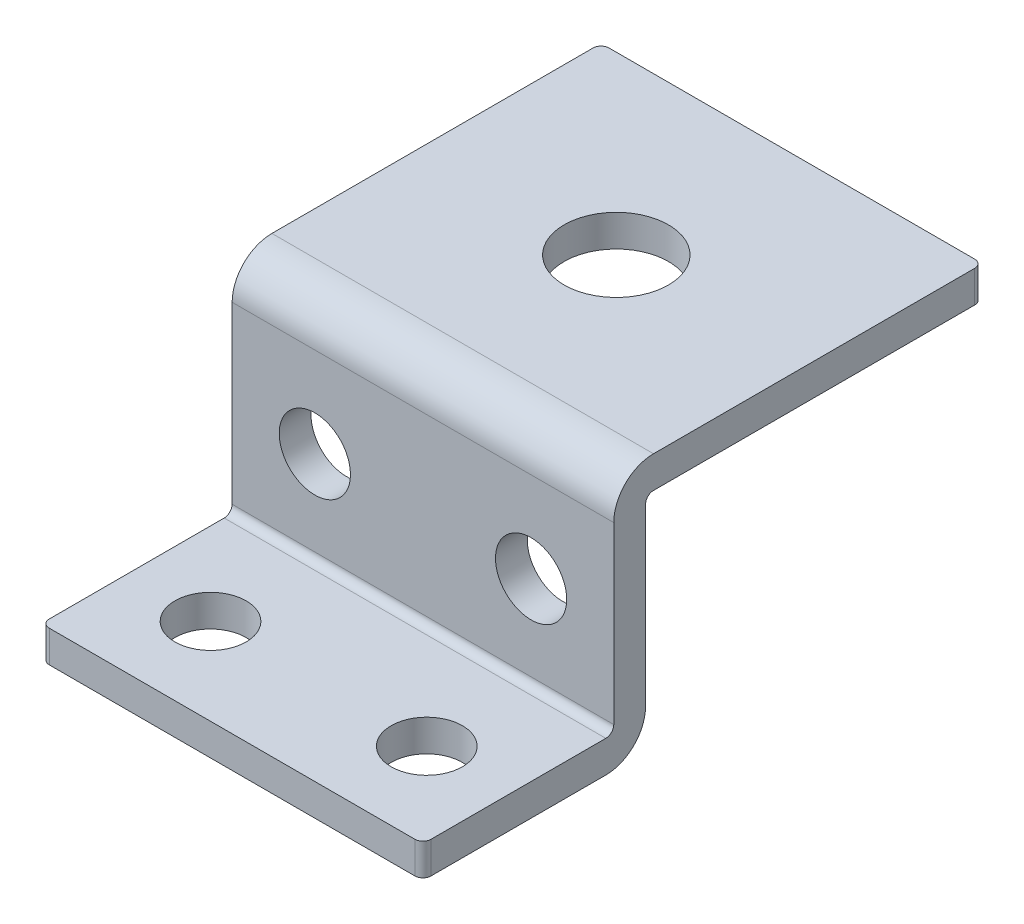
ISO-10303-21;
HEADER;
FILE_DESCRIPTION(('STEP AP214'),'2;1');
FILE_NAME('part.step','',(''),(''),'','','');
FILE_SCHEMA(('AUTOMOTIVE_DESIGN { 1 0 10303 214 1 1 1 1 }'));
ENDSEC;
DATA;
#1=APPLICATION_CONTEXT('core data for automotive mechanical design processes');
#2=APPLICATION_PROTOCOL_DEFINITION('international standard','automotive_design',2000,#1);
#3=PRODUCT_CONTEXT('',#1,'mechanical');
#4=PRODUCT('Part','Part','',(#3));
#5=PRODUCT_RELATED_PRODUCT_CATEGORY('part','',(#4));
#6=PRODUCT_DEFINITION_FORMATION('','',#4);
#7=PRODUCT_DEFINITION_CONTEXT('part definition',#1,'design');
#8=PRODUCT_DEFINITION('design','',#6,#7);
#9=PRODUCT_DEFINITION_SHAPE('','',#8);
#10=(LENGTH_UNIT() NAMED_UNIT(*) SI_UNIT(.MILLI.,.METRE.));
#11=(NAMED_UNIT(*) PLANE_ANGLE_UNIT() SI_UNIT($,.RADIAN.));
#12=(NAMED_UNIT(*) SI_UNIT($,.STERADIAN.) SOLID_ANGLE_UNIT());
#13=UNCERTAINTY_MEASURE_WITH_UNIT(LENGTH_MEASURE(1.E-05),#10,'distance_accuracy_value','');
#14=(GEOMETRIC_REPRESENTATION_CONTEXT(3) GLOBAL_UNCERTAINTY_ASSIGNED_CONTEXT((#13)) GLOBAL_UNIT_ASSIGNED_CONTEXT((#10,
#11,#12)) REPRESENTATION_CONTEXT('',''));
#15=CARTESIAN_POINT('',(0.,0.,0.));
#16=DIRECTION('',(0.,0.,1.));
#17=DIRECTION('',(1.,0.,0.));
#18=AXIS2_PLACEMENT_3D('',#15,#16,#17);
#19=CARTESIAN_POINT('',(19.05,9.525,4.92125));
#20=DIRECTION('',(0.,1.,0.));
#21=DIRECTION('',(0.,0.,1.));
#22=AXIS2_PLACEMENT_3D('',#19,#20,#21);
#23=PLANE('',#22);
#24=CARTESIAN_POINT('',(0.,9.525,-10.414));
#25=DIRECTION('',(0.,1.,0.));
#26=DIRECTION('',(0.,0.,1.));
#27=AXIS2_PLACEMENT_3D('',#24,#25,#26);
#28=CIRCLE('',#27,5.20699999999996);
#29=CARTESIAN_POINT('',(0.,9.525,-5.20700000000004));
#30=VERTEX_POINT('',#29);
#31=EDGE_CURVE('E191',#30,#30,#28,.T.);
#32=ORIENTED_EDGE('',*,*,#31,.T.);
#33=EDGE_LOOP('',(#32));
#34=FACE_BOUND('',#33,.T.);
#35=DIRECTION('',(0.,0.,-1.));
#36=VECTOR('',#35,1.);
#37=CARTESIAN_POINT('',(-19.05,9.525,4.92125));
#38=LINE('',#37,#36);
#39=CARTESIAN_POINT('',(-19.05,9.525,4.92125));
#40=VERTEX_POINT('',#39);
#41=CARTESIAN_POINT('',(-19.05,9.525,-27.14625));
#42=VERTEX_POINT('',#41);
#43=EDGE_CURVE('E188',#40,#42,#38,.T.);
#44=ORIENTED_EDGE('',*,*,#43,.T.);
#45=CARTESIAN_POINT('',(-18.25625,9.525,-27.14625));
#46=DIRECTION('',(0.,1.,0.));
#47=DIRECTION('',(0.,0.,1.));
#48=AXIS2_PLACEMENT_3D('',#45,#46,#47);
#49=CIRCLE('',#48,0.79375);
#50=CARTESIAN_POINT('',(-18.25625,9.525,-27.94));
#51=VERTEX_POINT('',#50);
#52=EDGE_CURVE('E269',#42,#51,#49,.F.);
#53=ORIENTED_EDGE('',*,*,#52,.T.);
#54=DIRECTION('',(-1.,0.,0.));
#55=VECTOR('',#54,1.);
#56=CARTESIAN_POINT('',(19.05,9.525,-27.94));
#57=LINE('',#56,#55);
#58=CARTESIAN_POINT('',(18.25625,9.525,-27.94));
#59=VERTEX_POINT('',#58);
#60=EDGE_CURVE('E235',#59,#51,#57,.T.);
#61=ORIENTED_EDGE('',*,*,#60,.F.);
#62=CARTESIAN_POINT('',(18.25625,9.525,-27.14625));
#63=DIRECTION('',(0.,1.,0.));
#64=DIRECTION('',(0.,0.,1.));
#65=AXIS2_PLACEMENT_3D('',#62,#63,#64);
#66=CIRCLE('',#65,0.79375);
#67=CARTESIAN_POINT('',(19.05,9.525,-27.14625));
#68=VERTEX_POINT('',#67);
#69=EDGE_CURVE('E267',#59,#68,#66,.F.);
#70=ORIENTED_EDGE('',*,*,#69,.T.);
#71=DIRECTION('',(0.,0.,-1.));
#72=VECTOR('',#71,1.);
#73=CARTESIAN_POINT('',(19.05,9.525,4.92125));
#74=LINE('',#73,#72);
#75=CARTESIAN_POINT('',(19.05,9.525,4.92125));
#76=VERTEX_POINT('',#75);
#77=EDGE_CURVE('E166',#76,#68,#74,.T.);
#78=ORIENTED_EDGE('',*,*,#77,.F.);
#79=DIRECTION('',(-1.,0.,0.));
#80=VECTOR('',#79,1.);
#81=CARTESIAN_POINT('',(19.05,9.525,4.92125));
#82=LINE('',#81,#80);
#83=EDGE_CURVE('E187',#76,#40,#82,.T.);
#84=ORIENTED_EDGE('',*,*,#83,.T.);
#85=EDGE_LOOP('',(#44,#53,#61,#70,#78,#84));
#86=FACE_BOUND('',#85,.T.);
#87=ADVANCED_FACE('F32',(#34,#86),#23,.F.);
#88=CARTESIAN_POINT('',(19.05,12.7,-27.94));
#89=DIRECTION('',(0.,0.,-1.));
#90=DIRECTION('',(-1.,0.,0.));
#91=AXIS2_PLACEMENT_3D('',#88,#89,#90);
#92=PLANE('',#91);
#93=ORIENTED_EDGE('',*,*,#60,.T.);
#94=DIRECTION('',(0.,-1.,0.));
#95=VECTOR('',#94,1.);
#96=CARTESIAN_POINT('',(-18.25625,12.7,-27.94));
#97=LINE('',#96,#95);
#98=CARTESIAN_POINT('',(-18.25625,12.7,-27.94));
#99=VERTEX_POINT('',#98);
#100=EDGE_CURVE('E47',#51,#99,#97,.F.);
#101=ORIENTED_EDGE('',*,*,#100,.T.);
#102=DIRECTION('',(-1.,0.,0.));
#103=VECTOR('',#102,1.);
#104=CARTESIAN_POINT('',(19.05,12.7,-27.94));
#105=LINE('',#104,#103);
#106=CARTESIAN_POINT('',(18.25625,12.7,-27.94));
#107=VERTEX_POINT('',#106);
#108=EDGE_CURVE('E153',#107,#99,#105,.T.);
#109=ORIENTED_EDGE('',*,*,#108,.F.);
#110=DIRECTION('',(0.,-1.,0.));
#111=VECTOR('',#110,1.);
#112=CARTESIAN_POINT('',(18.25625,9.525,-27.94));
#113=LINE('',#112,#111);
#114=EDGE_CURVE('E271',#107,#59,#113,.T.);
#115=ORIENTED_EDGE('',*,*,#114,.T.);
#116=EDGE_LOOP('',(#93,#101,#109,#115));
#117=FACE_BOUND('',#116,.T.);
#118=ADVANCED_FACE('F276',(#117),#92,.T.);
#119=CARTESIAN_POINT('',(19.05,12.7,4.92125));
#120=DIRECTION('',(0.,1.,0.));
#121=DIRECTION('',(0.,0.,1.));
#122=AXIS2_PLACEMENT_3D('',#119,#120,#121);
#123=PLANE('',#122);
#124=CARTESIAN_POINT('',(0.,12.7,-10.414));
#125=DIRECTION('',(0.,1.,0.));
#126=DIRECTION('',(0.,0.,1.));
#127=AXIS2_PLACEMENT_3D('',#124,#125,#126);
#128=CIRCLE('',#127,5.20699999999996);
#129=CARTESIAN_POINT('',(0.,12.7,-5.20700000000004));
#130=VERTEX_POINT('',#129);
#131=EDGE_CURVE('E341',#130,#130,#128,.T.);
#132=ORIENTED_EDGE('',*,*,#131,.F.);
#133=EDGE_LOOP('',(#132));
#134=FACE_BOUND('',#133,.T.);
#135=ORIENTED_EDGE('',*,*,#108,.T.);
#136=CARTESIAN_POINT('',(-18.25625,12.7,-27.14625));
#137=DIRECTION('',(0.,1.,0.));
#138=DIRECTION('',(0.,0.,1.));
#139=AXIS2_PLACEMENT_3D('',#136,#137,#138);
#140=CIRCLE('',#139,0.79375);
#141=CARTESIAN_POINT('',(-19.05,12.7,-27.14625));
#142=VERTEX_POINT('',#141);
#143=EDGE_CURVE('E11',#99,#142,#140,.T.);
#144=ORIENTED_EDGE('',*,*,#143,.T.);
#145=DIRECTION('',(0.,0.,-1.));
#146=VECTOR('',#145,1.);
#147=CARTESIAN_POINT('',(-19.05,12.7,4.92125));
#148=LINE('',#147,#146);
#149=CARTESIAN_POINT('',(-19.05,12.7,4.92125));
#150=VERTEX_POINT('',#149);
#151=EDGE_CURVE('E148',#150,#142,#148,.T.);
#152=ORIENTED_EDGE('',*,*,#151,.F.);
#153=DIRECTION('',(-1.,0.,0.));
#154=VECTOR('',#153,1.);
#155=CARTESIAN_POINT('',(19.05,12.7,4.92125));
#156=LINE('',#155,#154);
#157=CARTESIAN_POINT('',(19.05,12.7,4.92125));
#158=VERTEX_POINT('',#157);
#159=EDGE_CURVE('E143',#158,#150,#156,.T.);
#160=ORIENTED_EDGE('',*,*,#159,.F.);
#161=DIRECTION('',(0.,0.,-1.));
#162=VECTOR('',#161,1.);
#163=CARTESIAN_POINT('',(19.05,12.7,4.92125));
#164=LINE('',#163,#162);
#165=CARTESIAN_POINT('',(19.05,12.7,-27.14625));
#166=VERTEX_POINT('',#165);
#167=EDGE_CURVE('E146',#158,#166,#164,.T.);
#168=ORIENTED_EDGE('',*,*,#167,.T.);
#169=CARTESIAN_POINT('',(18.25625,12.7,-27.14625));
#170=DIRECTION('',(0.,1.,0.));
#171=DIRECTION('',(0.,0.,1.));
#172=AXIS2_PLACEMENT_3D('',#169,#170,#171);
#173=CIRCLE('',#172,0.79375);
#174=EDGE_CURVE('E40',#166,#107,#173,.T.);
#175=ORIENTED_EDGE('',*,*,#174,.T.);
#176=EDGE_LOOP('',(#135,#144,#152,#160,#168,#175));
#177=FACE_BOUND('',#176,.T.);
#178=ADVANCED_FACE('F145',(#134,#177),#123,.T.);
#179=CARTESIAN_POINT('',(19.05,8.73125,4.92125));
#180=DIRECTION('',(-1.,0.,0.));
#181=DIRECTION('',(0.,0.,1.));
#182=AXIS2_PLACEMENT_3D('',#179,#180,#181);
#183=CYLINDRICAL_SURFACE('',#182,3.96875);
#184=CARTESIAN_POINT('',(-19.05,8.73125,4.92125));
#185=DIRECTION('',(-1.,0.,0.));
#186=DIRECTION('',(0.,0.,-1.));
#187=AXIS2_PLACEMENT_3D('',#184,#185,#186);
#188=CIRCLE('',#187,3.96875);
#189=CARTESIAN_POINT('',(-19.05,8.73125,8.89));
#190=VERTEX_POINT('',#189);
#191=EDGE_CURVE('E193',#190,#150,#188,.T.);
#192=ORIENTED_EDGE('',*,*,#191,.F.);
#193=DIRECTION('',(-1.,0.,0.));
#194=VECTOR('',#193,1.);
#195=CARTESIAN_POINT('',(19.05,8.73125,8.89));
#196=LINE('',#195,#194);
#197=CARTESIAN_POINT('',(19.05,8.73125,8.89));
#198=VERTEX_POINT('',#197);
#199=EDGE_CURVE('E154',#198,#190,#196,.T.);
#200=ORIENTED_EDGE('',*,*,#199,.F.);
#201=CARTESIAN_POINT('',(19.05,8.73125,4.92125));
#202=DIRECTION('',(-1.,0.,0.));
#203=DIRECTION('',(0.,0.,-1.));
#204=AXIS2_PLACEMENT_3D('',#201,#202,#203);
#205=CIRCLE('',#204,3.96875);
#206=EDGE_CURVE('E161',#198,#158,#205,.T.);
#207=ORIENTED_EDGE('',*,*,#206,.T.);
#208=ORIENTED_EDGE('',*,*,#159,.T.);
#209=EDGE_LOOP('',(#192,#200,#207,#208));
#210=FACE_BOUND('',#209,.T.);
#211=ADVANCED_FACE('F168',(#210),#183,.T.);
#212=CARTESIAN_POINT('',(19.05,-8.73125,8.89));
#213=DIRECTION('',(0.,0.,1.));
#214=DIRECTION('',(0.,-1.,0.));
#215=AXIS2_PLACEMENT_3D('',#212,#213,#214);
#216=PLANE('',#215);
#217=CARTESIAN_POINT('',(10.795,-0.254000000000001,8.89));
#218=DIRECTION('',(0.,0.,1.));
#219=DIRECTION('',(0.,-1.,0.));
#220=AXIS2_PLACEMENT_3D('',#217,#218,#219);
#221=CIRCLE('',#220,3.556);
#222=CARTESIAN_POINT('',(14.351,-0.254000000000001,8.89));
#223=VERTEX_POINT('',#222);
#224=EDGE_CURVE('E245',#223,#223,#221,.T.);
#225=ORIENTED_EDGE('',*,*,#224,.F.);
#226=EDGE_LOOP('',(#225));
#227=FACE_BOUND('',#226,.T.);
#228=CARTESIAN_POINT('',(-10.795,-0.254000000000001,8.89));
#229=DIRECTION('',(0.,0.,1.));
#230=DIRECTION('',(0.,-1.,0.));
#231=AXIS2_PLACEMENT_3D('',#228,#229,#230);
#232=CIRCLE('',#231,3.556);
#233=CARTESIAN_POINT('',(-7.239,-0.254000000000001,8.89));
#234=VERTEX_POINT('',#233);
#235=EDGE_CURVE('E241',#234,#234,#232,.T.);
#236=ORIENTED_EDGE('',*,*,#235,.F.);
#237=EDGE_LOOP('',(#236));
#238=FACE_BOUND('',#237,.T.);
#239=DIRECTION('',(0.,1.,0.));
#240=VECTOR('',#239,1.);
#241=CARTESIAN_POINT('',(-19.05,-8.73125,8.89));
#242=LINE('',#241,#240);
#243=CARTESIAN_POINT('',(-19.05,-8.73125,8.89));
#244=VERTEX_POINT('',#243);
#245=EDGE_CURVE('E195',#244,#190,#242,.T.);
#246=ORIENTED_EDGE('',*,*,#245,.F.);
#247=DIRECTION('',(-1.,0.,0.));
#248=VECTOR('',#247,1.);
#249=CARTESIAN_POINT('',(19.05,-8.73125,8.89));
#250=LINE('',#249,#248);
#251=CARTESIAN_POINT('',(19.05,-8.73125,8.89));
#252=VERTEX_POINT('',#251);
#253=EDGE_CURVE('E231',#252,#244,#250,.T.);
#254=ORIENTED_EDGE('',*,*,#253,.F.);
#255=DIRECTION('',(0.,1.,0.));
#256=VECTOR('',#255,1.);
#257=CARTESIAN_POINT('',(19.05,-8.73125,8.89));
#258=LINE('',#257,#256);
#259=EDGE_CURVE('E169',#252,#198,#258,.T.);
#260=ORIENTED_EDGE('',*,*,#259,.T.);
#261=ORIENTED_EDGE('',*,*,#199,.T.);
#262=EDGE_LOOP('',(#246,#254,#260,#261));
#263=FACE_BOUND('',#262,.T.);
#264=ADVANCED_FACE('F292',(#227,#238,#263),#216,.T.);
#265=CARTESIAN_POINT('',(19.05,-8.73125,9.68375));
#266=DIRECTION('',(-1.,0.,0.));
#267=DIRECTION('',(0.,0.,1.));
#268=AXIS2_PLACEMENT_3D('',#265,#266,#267);
#269=CYLINDRICAL_SURFACE('',#268,0.793749999999999);
#270=CARTESIAN_POINT('',(-19.05,-8.73125,9.68375));
#271=DIRECTION('',(1.,0.,0.));
#272=DIRECTION('',(0.,0.,-1.));
#273=AXIS2_PLACEMENT_3D('',#270,#271,#272);
#274=CIRCLE('',#273,0.793749999999999);
#275=CARTESIAN_POINT('',(-19.05,-9.525,9.68375));
#276=VERTEX_POINT('',#275);
#277=EDGE_CURVE('E198',#276,#244,#274,.T.);
#278=ORIENTED_EDGE('',*,*,#277,.F.);
#279=DIRECTION('',(-1.,0.,0.));
#280=VECTOR('',#279,1.);
#281=CARTESIAN_POINT('',(19.05,-9.525,9.68375));
#282=LINE('',#281,#280);
#283=CARTESIAN_POINT('',(19.05,-9.525,9.68375));
#284=VERTEX_POINT('',#283);
#285=EDGE_CURVE('E228',#284,#276,#282,.T.);
#286=ORIENTED_EDGE('',*,*,#285,.F.);
#287=CARTESIAN_POINT('',(19.05,-8.73125,9.68375));
#288=DIRECTION('',(1.,0.,0.));
#289=DIRECTION('',(0.,0.,-1.));
#290=AXIS2_PLACEMENT_3D('',#287,#288,#289);
#291=CIRCLE('',#290,0.793749999999999);
#292=EDGE_CURVE('E171',#284,#252,#291,.T.);
#293=ORIENTED_EDGE('',*,*,#292,.T.);
#294=ORIENTED_EDGE('',*,*,#253,.T.);
#295=EDGE_LOOP('',(#278,#286,#293,#294));
#296=FACE_BOUND('',#295,.T.);
#297=ADVANCED_FACE('F296',(#296),#269,.F.);
#298=CARTESIAN_POINT('',(19.05,-9.525,27.94));
#299=DIRECTION('',(0.,1.,0.));
#300=DIRECTION('',(0.,0.,1.));
#301=AXIS2_PLACEMENT_3D('',#298,#299,#300);
#302=PLANE('',#301);
#303=CARTESIAN_POINT('',(10.795,-9.525,19.304));
#304=DIRECTION('',(0.,1.,0.));
#305=DIRECTION('',(0.,0.,1.));
#306=AXIS2_PLACEMENT_3D('',#303,#304,#305);
#307=CIRCLE('',#306,3.556);
#308=CARTESIAN_POINT('',(10.795,-9.525,22.86));
#309=VERTEX_POINT('',#308);
#310=EDGE_CURVE('E335',#309,#309,#307,.T.);
#311=ORIENTED_EDGE('',*,*,#310,.F.);
#312=EDGE_LOOP('',(#311));
#313=FACE_BOUND('',#312,.T.);
#314=CARTESIAN_POINT('',(-10.795,-9.525,19.304));
#315=DIRECTION('',(0.,1.,0.));
#316=DIRECTION('',(0.,0.,1.));
#317=AXIS2_PLACEMENT_3D('',#314,#315,#316);
#318=CIRCLE('',#317,3.556);
#319=CARTESIAN_POINT('',(-10.795,-9.525,22.86));
#320=VERTEX_POINT('',#319);
#321=EDGE_CURVE('E338',#320,#320,#318,.T.);
#322=ORIENTED_EDGE('',*,*,#321,.F.);
#323=EDGE_LOOP('',(#322));
#324=FACE_BOUND('',#323,.T.);
#325=DIRECTION('',(0.,0.,-1.));
#326=VECTOR('',#325,1.);
#327=CARTESIAN_POINT('',(-19.05,-9.525,27.94));
#328=LINE('',#327,#326);
#329=CARTESIAN_POINT('',(-19.05,-9.525,27.14625));
#330=VERTEX_POINT('',#329);
#331=EDGE_CURVE('E201',#330,#276,#328,.T.);
#332=ORIENTED_EDGE('',*,*,#331,.F.);
#333=CARTESIAN_POINT('',(-18.25625,-9.525,27.14625));
#334=DIRECTION('',(0.,1.,0.));
#335=DIRECTION('',(0.,0.,1.));
#336=AXIS2_PLACEMENT_3D('',#333,#334,#335);
#337=CIRCLE('',#336,0.79375);
#338=CARTESIAN_POINT('',(-18.25625,-9.525,27.94));
#339=VERTEX_POINT('',#338);
#340=EDGE_CURVE('E253',#330,#339,#337,.T.);
#341=ORIENTED_EDGE('',*,*,#340,.T.);
#342=DIRECTION('',(-1.,0.,0.));
#343=VECTOR('',#342,1.);
#344=CARTESIAN_POINT('',(19.05,-9.525,27.94));
#345=LINE('',#344,#343);
#346=CARTESIAN_POINT('',(18.25625,-9.525,27.94));
#347=VERTEX_POINT('',#346);
#348=EDGE_CURVE('E225',#347,#339,#345,.T.);
#349=ORIENTED_EDGE('',*,*,#348,.F.);
#350=CARTESIAN_POINT('',(18.25625,-9.525,27.14625));
#351=DIRECTION('',(0.,1.,0.));
#352=DIRECTION('',(0.,0.,1.));
#353=AXIS2_PLACEMENT_3D('',#350,#351,#352);
#354=CIRCLE('',#353,0.79375);
#355=CARTESIAN_POINT('',(19.05,-9.525,27.14625));
#356=VERTEX_POINT('',#355);
#357=EDGE_CURVE('E251',#347,#356,#354,.T.);
#358=ORIENTED_EDGE('',*,*,#357,.T.);
#359=DIRECTION('',(0.,0.,-1.));
#360=VECTOR('',#359,1.);
#361=CARTESIAN_POINT('',(19.05,-9.525,27.94));
#362=LINE('',#361,#360);
#363=EDGE_CURVE('E177',#356,#284,#362,.T.);
#364=ORIENTED_EDGE('',*,*,#363,.T.);
#365=ORIENTED_EDGE('',*,*,#285,.T.);
#366=EDGE_LOOP('',(#332,#341,#349,#358,#364,#365));
#367=FACE_BOUND('',#366,.T.);
#368=ADVANCED_FACE('F299',(#313,#324,#367),#302,.T.);
#369=CARTESIAN_POINT('',(19.05,-12.7,27.94));
#370=DIRECTION('',(0.,0.,1.));
#371=DIRECTION('',(1.,0.,0.));
#372=AXIS2_PLACEMENT_3D('',#369,#370,#371);
#373=PLANE('',#372);
#374=ORIENTED_EDGE('',*,*,#348,.T.);
#375=DIRECTION('',(0.,1.,0.));
#376=VECTOR('',#375,1.);
#377=CARTESIAN_POINT('',(-18.25625,-12.7,27.94));
#378=LINE('',#377,#376);
#379=CARTESIAN_POINT('',(-18.25625,-12.7,27.94));
#380=VERTEX_POINT('',#379);
#381=EDGE_CURVE('E258',#339,#380,#378,.F.);
#382=ORIENTED_EDGE('',*,*,#381,.T.);
#383=DIRECTION('',(-1.,0.,0.));
#384=VECTOR('',#383,1.);
#385=CARTESIAN_POINT('',(19.05,-12.7,27.94));
#386=LINE('',#385,#384);
#387=CARTESIAN_POINT('',(18.25625,-12.7,27.94));
#388=VERTEX_POINT('',#387);
#389=EDGE_CURVE('E222',#388,#380,#386,.T.);
#390=ORIENTED_EDGE('',*,*,#389,.F.);
#391=DIRECTION('',(0.,1.,0.));
#392=VECTOR('',#391,1.);
#393=CARTESIAN_POINT('',(18.25625,-9.525,27.94));
#394=LINE('',#393,#392);
#395=EDGE_CURVE('E255',#388,#347,#394,.T.);
#396=ORIENTED_EDGE('',*,*,#395,.T.);
#397=EDGE_LOOP('',(#374,#382,#390,#396));
#398=FACE_BOUND('',#397,.T.);
#399=ADVANCED_FACE('F313',(#398),#373,.T.);
#400=CARTESIAN_POINT('',(19.05,-12.7,27.94));
#401=DIRECTION('',(0.,1.,0.));
#402=DIRECTION('',(0.,0.,1.));
#403=AXIS2_PLACEMENT_3D('',#400,#401,#402);
#404=PLANE('',#403);
#405=CARTESIAN_POINT('',(10.795,-12.7,19.304));
#406=DIRECTION('',(0.,1.,0.));
#407=DIRECTION('',(0.,0.,1.));
#408=AXIS2_PLACEMENT_3D('',#405,#406,#407);
#409=CIRCLE('',#408,3.556);
#410=CARTESIAN_POINT('',(10.795,-12.7,22.86));
#411=VERTEX_POINT('',#410);
#412=EDGE_CURVE('E345',#411,#411,#409,.T.);
#413=ORIENTED_EDGE('',*,*,#412,.T.);
#414=EDGE_LOOP('',(#413));
#415=FACE_BOUND('',#414,.T.);
#416=CARTESIAN_POINT('',(-10.795,-12.7,19.304));
#417=DIRECTION('',(0.,1.,0.));
#418=DIRECTION('',(0.,0.,1.));
#419=AXIS2_PLACEMENT_3D('',#416,#417,#418);
#420=CIRCLE('',#419,3.556);
#421=CARTESIAN_POINT('',(-10.795,-12.7,22.86));
#422=VERTEX_POINT('',#421);
#423=EDGE_CURVE('E342',#422,#422,#420,.T.);
#424=ORIENTED_EDGE('',*,*,#423,.T.);
#425=EDGE_LOOP('',(#424));
#426=FACE_BOUND('',#425,.T.);
#427=ORIENTED_EDGE('',*,*,#389,.T.);
#428=CARTESIAN_POINT('',(-18.25625,-12.7,27.14625));
#429=DIRECTION('',(0.,1.,0.));
#430=DIRECTION('',(0.,0.,1.));
#431=AXIS2_PLACEMENT_3D('',#428,#429,#430);
#432=CIRCLE('',#431,0.79375);
#433=CARTESIAN_POINT('',(-19.05,-12.7,27.14625));
#434=VERTEX_POINT('',#433);
#435=EDGE_CURVE('E262',#380,#434,#432,.F.);
#436=ORIENTED_EDGE('',*,*,#435,.T.);
#437=DIRECTION('',(0.,0.,-1.));
#438=VECTOR('',#437,1.);
#439=CARTESIAN_POINT('',(-19.05,-12.7,27.94));
#440=LINE('',#439,#438);
#441=CARTESIAN_POINT('',(-19.05,-12.7,9.68375));
#442=VERTEX_POINT('',#441);
#443=EDGE_CURVE('E203',#434,#442,#440,.T.);
#444=ORIENTED_EDGE('',*,*,#443,.T.);
#445=DIRECTION('',(-1.,0.,0.));
#446=VECTOR('',#445,1.);
#447=CARTESIAN_POINT('',(19.05,-12.7,9.68375));
#448=LINE('',#447,#446);
#449=CARTESIAN_POINT('',(19.05,-12.7,9.68375));
#450=VERTEX_POINT('',#449);
#451=EDGE_CURVE('E219',#450,#442,#448,.T.);
#452=ORIENTED_EDGE('',*,*,#451,.F.);
#453=DIRECTION('',(0.,0.,-1.));
#454=VECTOR('',#453,1.);
#455=CARTESIAN_POINT('',(19.05,-12.7,27.94));
#456=LINE('',#455,#454);
#457=CARTESIAN_POINT('',(19.05,-12.7,27.14625));
#458=VERTEX_POINT('',#457);
#459=EDGE_CURVE('E179',#458,#450,#456,.T.);
#460=ORIENTED_EDGE('',*,*,#459,.F.);
#461=CARTESIAN_POINT('',(18.25625,-12.7,27.14625));
#462=DIRECTION('',(0.,1.,0.));
#463=DIRECTION('',(0.,0.,1.));
#464=AXIS2_PLACEMENT_3D('',#461,#462,#463);
#465=CIRCLE('',#464,0.79375);
#466=EDGE_CURVE('E260',#458,#388,#465,.F.);
#467=ORIENTED_EDGE('',*,*,#466,.T.);
#468=EDGE_LOOP('',(#427,#436,#444,#452,#460,#467));
#469=FACE_BOUND('',#468,.T.);
#470=ADVANCED_FACE('F309',(#415,#426,#469),#404,.F.);
#471=CARTESIAN_POINT('',(19.05,-8.73125,9.68375));
#472=DIRECTION('',(-1.,0.,0.));
#473=DIRECTION('',(0.,0.,1.));
#474=AXIS2_PLACEMENT_3D('',#471,#472,#473);
#475=CYLINDRICAL_SURFACE('',#474,3.96875);
#476=CARTESIAN_POINT('',(-19.05,-8.73125,9.68375));
#477=DIRECTION('',(1.,0.,0.));
#478=DIRECTION('',(0.,0.,-1.));
#479=AXIS2_PLACEMENT_3D('',#476,#477,#478);
#480=CIRCLE('',#479,3.96875);
#481=CARTESIAN_POINT('',(-19.05,-8.73125,5.715));
#482=VERTEX_POINT('',#481);
#483=EDGE_CURVE('E205',#442,#482,#480,.T.);
#484=ORIENTED_EDGE('',*,*,#483,.T.);
#485=DIRECTION('',(-1.,0.,0.));
#486=VECTOR('',#485,1.);
#487=CARTESIAN_POINT('',(19.05,-8.73125,5.715));
#488=LINE('',#487,#486);
#489=CARTESIAN_POINT('',(19.05,-8.73125,5.715));
#490=VERTEX_POINT('',#489);
#491=EDGE_CURVE('E216',#490,#482,#488,.T.);
#492=ORIENTED_EDGE('',*,*,#491,.F.);
#493=CARTESIAN_POINT('',(19.05,-8.73125,9.68375));
#494=DIRECTION('',(1.,0.,0.));
#495=DIRECTION('',(0.,0.,-1.));
#496=AXIS2_PLACEMENT_3D('',#493,#494,#495);
#497=CIRCLE('',#496,3.96875);
#498=EDGE_CURVE('E181',#450,#490,#497,.T.);
#499=ORIENTED_EDGE('',*,*,#498,.F.);
#500=ORIENTED_EDGE('',*,*,#451,.T.);
#501=EDGE_LOOP('',(#484,#492,#499,#500));
#502=FACE_BOUND('',#501,.T.);
#503=ADVANCED_FACE('F322',(#502),#475,.T.);
#504=CARTESIAN_POINT('',(19.05,-8.73125,5.715));
#505=DIRECTION('',(0.,0.,1.));
#506=DIRECTION('',(0.,-1.,0.));
#507=AXIS2_PLACEMENT_3D('',#504,#505,#506);
#508=PLANE('',#507);
#509=CARTESIAN_POINT('',(10.795,-0.254000000000001,5.715));
#510=DIRECTION('',(0.,0.,1.));
#511=DIRECTION('',(0.,-1.,0.));
#512=AXIS2_PLACEMENT_3D('',#509,#510,#511);
#513=CIRCLE('',#512,3.556);
#514=CARTESIAN_POINT('',(14.351,-0.254000000000001,5.71499999999999));
#515=VERTEX_POINT('',#514);
#516=EDGE_CURVE('E242',#515,#515,#513,.T.);
#517=ORIENTED_EDGE('',*,*,#516,.T.);
#518=EDGE_LOOP('',(#517));
#519=FACE_BOUND('',#518,.T.);
#520=CARTESIAN_POINT('',(-10.795,-0.254000000000001,5.715));
#521=DIRECTION('',(0.,0.,1.));
#522=DIRECTION('',(0.,-1.,0.));
#523=AXIS2_PLACEMENT_3D('',#520,#521,#522);
#524=CIRCLE('',#523,3.556);
#525=CARTESIAN_POINT('',(-7.239,-0.254000000000001,5.71499999999999));
#526=VERTEX_POINT('',#525);
#527=EDGE_CURVE('E238',#526,#526,#524,.T.);
#528=ORIENTED_EDGE('',*,*,#527,.T.);
#529=EDGE_LOOP('',(#528));
#530=FACE_BOUND('',#529,.T.);
#531=DIRECTION('',(0.,1.,0.));
#532=VECTOR('',#531,1.);
#533=CARTESIAN_POINT('',(-19.05,-8.73125,5.715));
#534=LINE('',#533,#532);
#535=CARTESIAN_POINT('',(-19.05,8.73125,5.715));
#536=VERTEX_POINT('',#535);
#537=EDGE_CURVE('E207',#482,#536,#534,.T.);
#538=ORIENTED_EDGE('',*,*,#537,.T.);
#539=DIRECTION('',(-1.,0.,0.));
#540=VECTOR('',#539,1.);
#541=CARTESIAN_POINT('',(19.05,8.73125,5.715));
#542=LINE('',#541,#540);
#543=CARTESIAN_POINT('',(19.05,8.73125,5.715));
#544=VERTEX_POINT('',#543);
#545=EDGE_CURVE('E213',#544,#536,#542,.T.);
#546=ORIENTED_EDGE('',*,*,#545,.F.);
#547=DIRECTION('',(0.,1.,0.));
#548=VECTOR('',#547,1.);
#549=CARTESIAN_POINT('',(19.05,-8.73125,5.715));
#550=LINE('',#549,#548);
#551=EDGE_CURVE('E183',#490,#544,#550,.T.);
#552=ORIENTED_EDGE('',*,*,#551,.F.);
#553=ORIENTED_EDGE('',*,*,#491,.T.);
#554=EDGE_LOOP('',(#538,#546,#552,#553));
#555=FACE_BOUND('',#554,.T.);
#556=ADVANCED_FACE('F326',(#519,#530,#555),#508,.F.);
#557=CARTESIAN_POINT('',(19.05,8.73125,4.92125));
#558=DIRECTION('',(-1.,0.,0.));
#559=DIRECTION('',(0.,0.,1.));
#560=AXIS2_PLACEMENT_3D('',#557,#558,#559);
#561=CYLINDRICAL_SURFACE('',#560,0.79375);
#562=CARTESIAN_POINT('',(-19.05,8.73125,4.92125));
#563=DIRECTION('',(1.,0.,0.));
#564=DIRECTION('',(0.,0.,-1.));
#565=AXIS2_PLACEMENT_3D('',#562,#563,#564);
#566=CIRCLE('',#565,0.79375);
#567=EDGE_CURVE('E209',#536,#40,#566,.F.);
#568=ORIENTED_EDGE('',*,*,#567,.T.);
#569=ORIENTED_EDGE('',*,*,#83,.F.);
#570=CARTESIAN_POINT('',(19.05,8.73125,4.92125));
#571=DIRECTION('',(1.,0.,0.));
#572=DIRECTION('',(0.,0.,-1.));
#573=AXIS2_PLACEMENT_3D('',#570,#571,#572);
#574=CIRCLE('',#573,0.79375);
#575=EDGE_CURVE('E185',#544,#76,#574,.F.);
#576=ORIENTED_EDGE('',*,*,#575,.F.);
#577=ORIENTED_EDGE('',*,*,#545,.T.);
#578=EDGE_LOOP('',(#568,#569,#576,#577));
#579=FACE_BOUND('',#578,.T.);
#580=ADVANCED_FACE('F331',(#579),#561,.F.);
#581=CARTESIAN_POINT('',(19.05,8.73125,4.92125));
#582=DIRECTION('',(-1.,0.,0.));
#583=DIRECTION('',(0.,0.,1.));
#584=AXIS2_PLACEMENT_3D('',#581,#582,#583);
#585=PLANE('',#584);
#586=ORIENTED_EDGE('',*,*,#363,.F.);
#587=DIRECTION('',(0.,1.,0.));
#588=VECTOR('',#587,1.);
#589=CARTESIAN_POINT('',(19.05,-12.7,27.14625));
#590=LINE('',#589,#588);
#591=EDGE_CURVE('E265',#356,#458,#590,.F.);
#592=ORIENTED_EDGE('',*,*,#591,.T.);
#593=ORIENTED_EDGE('',*,*,#459,.T.);
#594=ORIENTED_EDGE('',*,*,#498,.T.);
#595=ORIENTED_EDGE('',*,*,#551,.T.);
#596=ORIENTED_EDGE('',*,*,#575,.T.);
#597=ORIENTED_EDGE('',*,*,#77,.T.);
#598=DIRECTION('',(0.,-1.,0.));
#599=VECTOR('',#598,1.);
#600=CARTESIAN_POINT('',(19.05,12.7,-27.14625));
#601=LINE('',#600,#599);
#602=EDGE_CURVE('E165',#68,#166,#601,.F.);
#603=ORIENTED_EDGE('',*,*,#602,.T.);
#604=ORIENTED_EDGE('',*,*,#167,.F.);
#605=ORIENTED_EDGE('',*,*,#206,.F.);
#606=ORIENTED_EDGE('',*,*,#259,.F.);
#607=ORIENTED_EDGE('',*,*,#292,.F.);
#608=EDGE_LOOP('',(#586,#592,#593,#594,#595,#596,#597,#603,#604,#605,#606,#607));
#609=FACE_BOUND('',#608,.T.);
#610=ADVANCED_FACE('F159',(#609),#585,.F.);
#611=CARTESIAN_POINT('',(-19.05,8.73125,4.92125));
#612=DIRECTION('',(-1.,0.,0.));
#613=DIRECTION('',(0.,0.,1.));
#614=AXIS2_PLACEMENT_3D('',#611,#612,#613);
#615=PLANE('',#614);
#616=ORIENTED_EDGE('',*,*,#443,.F.);
#617=DIRECTION('',(0.,1.,0.));
#618=VECTOR('',#617,1.);
#619=CARTESIAN_POINT('',(-19.05,8.73125,27.14625));
#620=LINE('',#619,#618);
#621=EDGE_CURVE('E248',#434,#330,#620,.T.);
#622=ORIENTED_EDGE('',*,*,#621,.T.);
#623=ORIENTED_EDGE('',*,*,#331,.T.);
#624=ORIENTED_EDGE('',*,*,#277,.T.);
#625=ORIENTED_EDGE('',*,*,#245,.T.);
#626=ORIENTED_EDGE('',*,*,#191,.T.);
#627=ORIENTED_EDGE('',*,*,#151,.T.);
#628=DIRECTION('',(0.,-1.,0.));
#629=VECTOR('',#628,1.);
#630=CARTESIAN_POINT('',(-19.05,8.73125,-27.14625));
#631=LINE('',#630,#629);
#632=EDGE_CURVE('E237',#142,#42,#631,.T.);
#633=ORIENTED_EDGE('',*,*,#632,.T.);
#634=ORIENTED_EDGE('',*,*,#43,.F.);
#635=ORIENTED_EDGE('',*,*,#567,.F.);
#636=ORIENTED_EDGE('',*,*,#537,.F.);
#637=ORIENTED_EDGE('',*,*,#483,.F.);
#638=EDGE_LOOP('',(#616,#622,#623,#624,#625,#626,#627,#633,#634,#635,#636,#637));
#639=FACE_BOUND('',#638,.T.);
#640=ADVANCED_FACE('F287',(#639),#615,.T.);
#641=CARTESIAN_POINT('',(-10.795,-12.7,19.304));
#642=DIRECTION('',(0.,1.,0.));
#643=DIRECTION('',(0.,0.,1.));
#644=AXIS2_PLACEMENT_3D('',#641,#642,#643);
#645=CYLINDRICAL_SURFACE('',#644,3.556);
#646=ORIENTED_EDGE('',*,*,#321,.T.);
#647=EDGE_LOOP('',(#646));
#648=FACE_BOUND('',#647,.T.);
#649=ORIENTED_EDGE('',*,*,#423,.F.);
#650=EDGE_LOOP('',(#649));
#651=FACE_BOUND('',#650,.T.);
#652=ADVANCED_FACE('F414',(#648,#651),#645,.F.);
#653=CARTESIAN_POINT('',(10.795,-12.7,19.304));
#654=DIRECTION('',(0.,1.,0.));
#655=DIRECTION('',(0.,0.,1.));
#656=AXIS2_PLACEMENT_3D('',#653,#654,#655);
#657=CYLINDRICAL_SURFACE('',#656,3.556);
#658=ORIENTED_EDGE('',*,*,#310,.T.);
#659=EDGE_LOOP('',(#658));
#660=FACE_BOUND('',#659,.T.);
#661=ORIENTED_EDGE('',*,*,#412,.F.);
#662=EDGE_LOOP('',(#661));
#663=FACE_BOUND('',#662,.T.);
#664=ADVANCED_FACE('F512',(#660,#663),#657,.F.);
#665=CARTESIAN_POINT('',(0.,-12.7,-10.414));
#666=DIRECTION('',(0.,1.,0.));
#667=DIRECTION('',(0.,0.,1.));
#668=AXIS2_PLACEMENT_3D('',#665,#666,#667);
#669=CYLINDRICAL_SURFACE('',#668,5.20699999999996);
#670=ORIENTED_EDGE('',*,*,#131,.T.);
#671=EDGE_LOOP('',(#670));
#672=FACE_BOUND('',#671,.T.);
#673=ORIENTED_EDGE('',*,*,#31,.F.);
#674=EDGE_LOOP('',(#673));
#675=FACE_BOUND('',#674,.T.);
#676=ADVANCED_FACE('F490',(#672,#675),#669,.F.);
#677=CARTESIAN_POINT('',(-10.795,-0.254000000000001,-27.94));
#678=DIRECTION('',(0.,0.,1.));
#679=DIRECTION('',(1.,0.,0.));
#680=AXIS2_PLACEMENT_3D('',#677,#678,#679);
#681=CYLINDRICAL_SURFACE('',#680,3.556);
#682=CARTESIAN_POINT('',(-7.239,-0.254000000000001,8.89));
#683=CARTESIAN_POINT('',(-7.239,-0.254000000000001,8.85692708333334));
#684=CARTESIAN_POINT('',(-7.239,-0.254000000000001,8.82385416666667));
#685=CARTESIAN_POINT('',(-7.239,-0.254000000000001,8.75770833333334));
#686=CARTESIAN_POINT('',(-7.239,-0.254000000000001,8.72463541666667));
#687=CARTESIAN_POINT('',(-7.239,-0.254000000000001,8.65848958333333));
#688=CARTESIAN_POINT('',(-7.239,-0.254000000000001,8.62541666666667));
#689=CARTESIAN_POINT('',(-7.239,-0.254000000000001,8.55927083333333));
#690=CARTESIAN_POINT('',(-7.239,-0.254000000000001,8.52619791666667));
#691=CARTESIAN_POINT('',(-7.239,-0.254000000000001,8.46005208333333));
#692=CARTESIAN_POINT('',(-7.239,-0.254000000000001,8.42697916666667));
#693=CARTESIAN_POINT('',(-7.239,-0.254000000000001,8.36083333333333));
#694=CARTESIAN_POINT('',(-7.239,-0.254000000000001,8.32776041666667));
#695=CARTESIAN_POINT('',(-7.239,-0.254000000000001,8.26161458333333));
#696=CARTESIAN_POINT('',(-7.239,-0.254000000000001,8.22854166666666));
#697=CARTESIAN_POINT('',(-7.239,-0.254000000000001,8.16239583333333));
#698=CARTESIAN_POINT('',(-7.239,-0.254000000000001,8.12932291666667));
#699=CARTESIAN_POINT('',(-7.239,-0.254000000000001,8.06317708333333));
#700=CARTESIAN_POINT('',(-7.239,-0.254000000000001,8.03010416666667));
#701=CARTESIAN_POINT('',(-7.239,-0.254000000000001,7.96395833333333));
#702=CARTESIAN_POINT('',(-7.239,-0.254000000000001,7.93088541666666));
#703=CARTESIAN_POINT('',(-7.239,-0.254000000000001,7.86473958333333));
#704=CARTESIAN_POINT('',(-7.239,-0.254000000000001,7.83166666666667));
#705=CARTESIAN_POINT('',(-7.239,-0.254000000000001,7.76552083333333));
#706=CARTESIAN_POINT('',(-7.239,-0.254000000000001,7.73244791666667));
#707=CARTESIAN_POINT('',(-7.239,-0.254000000000001,7.66630208333333));
#708=CARTESIAN_POINT('',(-7.239,-0.254000000000001,7.63322916666666));
#709=CARTESIAN_POINT('',(-7.239,-0.254000000000001,7.56708333333333));
#710=CARTESIAN_POINT('',(-7.239,-0.254000000000001,7.53401041666666));
#711=CARTESIAN_POINT('',(-7.239,-0.254000000000001,7.46786458333333));
#712=CARTESIAN_POINT('',(-7.239,-0.254000000000001,7.43479166666666));
#713=CARTESIAN_POINT('',(-7.239,-0.254000000000001,7.36864583333333));
#714=CARTESIAN_POINT('',(-7.239,-0.254000000000001,7.33557291666666));
#715=CARTESIAN_POINT('',(-7.239,-0.254000000000001,7.26942708333333));
#716=CARTESIAN_POINT('',(-7.239,-0.254000000000001,7.23635416666666));
#717=CARTESIAN_POINT('',(-7.239,-0.254000000000001,7.17020833333333));
#718=CARTESIAN_POINT('',(-7.239,-0.254000000000001,7.13713541666666));
#719=CARTESIAN_POINT('',(-7.239,-0.254000000000001,7.07098958333333));
#720=CARTESIAN_POINT('',(-7.239,-0.254000000000001,7.03791666666666));
#721=CARTESIAN_POINT('',(-7.239,-0.254000000000001,6.97177083333333));
#722=CARTESIAN_POINT('',(-7.239,-0.254000000000001,6.93869791666666));
#723=CARTESIAN_POINT('',(-7.239,-0.254000000000001,6.87255208333333));
#724=CARTESIAN_POINT('',(-7.239,-0.254000000000001,6.83947916666666));
#725=CARTESIAN_POINT('',(-7.239,-0.254000000000001,6.77333333333333));
#726=CARTESIAN_POINT('',(-7.239,-0.254000000000001,6.74026041666666));
#727=CARTESIAN_POINT('',(-7.239,-0.254000000000001,6.67411458333333));
#728=CARTESIAN_POINT('',(-7.239,-0.254000000000001,6.64104166666666));
#729=CARTESIAN_POINT('',(-7.239,-0.254000000000001,6.57489583333333));
#730=CARTESIAN_POINT('',(-7.239,-0.254000000000001,6.54182291666666));
#731=CARTESIAN_POINT('',(-7.239,-0.254000000000001,6.47567708333333));
#732=CARTESIAN_POINT('',(-7.239,-0.254000000000001,6.44260416666666));
#733=CARTESIAN_POINT('',(-7.239,-0.254000000000001,6.37645833333333));
#734=CARTESIAN_POINT('',(-7.239,-0.254000000000001,6.34338541666666));
#735=CARTESIAN_POINT('',(-7.239,-0.254000000000001,6.27723958333333));
#736=CARTESIAN_POINT('',(-7.239,-0.254000000000001,6.24416666666666));
#737=CARTESIAN_POINT('',(-7.239,-0.254000000000001,6.17802083333333));
#738=CARTESIAN_POINT('',(-7.239,-0.254000000000001,6.14494791666666));
#739=CARTESIAN_POINT('',(-7.239,-0.254000000000001,6.07880208333333));
#740=CARTESIAN_POINT('',(-7.239,-0.254000000000001,6.04572916666666));
#741=CARTESIAN_POINT('',(-7.239,-0.254000000000001,5.97958333333333));
#742=CARTESIAN_POINT('',(-7.239,-0.254000000000001,5.94651041666666));
#743=CARTESIAN_POINT('',(-7.239,-0.254000000000001,5.88036458333332));
#744=CARTESIAN_POINT('',(-7.239,-0.254000000000001,5.84729166666666));
#745=CARTESIAN_POINT('',(-7.239,-0.254000000000001,5.78114583333332));
#746=CARTESIAN_POINT('',(-7.239,-0.254000000000001,5.74807291666666));
#747=CARTESIAN_POINT('',(-7.239,-0.254000000000001,5.71499999999999));
#748=B_SPLINE_CURVE_WITH_KNOTS('',3,(#682,#683,#684,#685,#686,#687,#688,#689,#690,#691,#692,
#693,#694,#695,#696,#697,#698,#699,#700,#701,#702,#703,#704,#705,#706,#707,#708,#709,#710,#711,
#712,#713,#714,#715,#716,#717,#718,#719,#720,#721,#722,#723,#724,#725,#726,#727,#728,#729,#730,
#731,#732,#733,#734,#735,#736,#737,#738,#739,#740,#741,#742,#743,#744,#745,#746,#747),
.UNSPECIFIED.,.F.,.F.,(4,2,2,2,2,2,2,2,2,2,2,2,2,2,2,2,2,2,2,2,2,2,2,2,2,2,2,2,2,2,2,2,4),(0.,
0.0992187499999977,0.198437500000002,0.29765625,0.396875000000005,0.496093750000003,0.5953125,
0.694531250000005,0.793750000000003,0.892968750000001,0.992187500000005,1.09140625,1.190625,
1.28984375000001,1.3890625,1.48828125000001,1.58750000000001,1.68671875,1.78593750000001,
1.88515625000001,1.98437500000001,2.08359375000001,2.18281250000001,2.28203125000001,
2.38125000000001,2.48046875000001,2.57968750000001,2.67890625000001,2.77812500000001,
2.87734375000001,2.97656250000001,3.07578125000001,3.17500000000001),.UNSPECIFIED.);
#749=EDGE_CURVE('BSEAM355',#234,#526,#748,.T.);
#750=ORIENTED_EDGE('',*,*,#235,.T.);
#751=ORIENTED_EDGE('',*,*,#527,.F.);
#752=ORIENTED_EDGE('',*,*,#749,.T.);
#753=ORIENTED_EDGE('',*,*,#749,.F.);
#754=EDGE_LOOP('',(#750,#752,#751,#753));
#755=FACE_BOUND('',#754,.T.);
#756=ADVANCED_FACE('F355',(#755),#681,.F.);
#757=CARTESIAN_POINT('',(10.795,-0.254000000000001,-27.94));
#758=DIRECTION('',(0.,0.,1.));
#759=DIRECTION('',(1.,0.,0.));
#760=AXIS2_PLACEMENT_3D('',#757,#758,#759);
#761=CYLINDRICAL_SURFACE('',#760,3.556);
#762=CARTESIAN_POINT('',(14.351,-0.254000000000001,8.89));
#763=CARTESIAN_POINT('',(14.351,-0.254000000000001,8.85692708333334));
#764=CARTESIAN_POINT('',(14.351,-0.254000000000001,8.82385416666667));
#765=CARTESIAN_POINT('',(14.351,-0.254000000000001,8.75770833333334));
#766=CARTESIAN_POINT('',(14.351,-0.254000000000001,8.72463541666667));
#767=CARTESIAN_POINT('',(14.351,-0.254000000000001,8.65848958333333));
#768=CARTESIAN_POINT('',(14.351,-0.254000000000001,8.62541666666667));
#769=CARTESIAN_POINT('',(14.351,-0.254000000000001,8.55927083333333));
#770=CARTESIAN_POINT('',(14.351,-0.254000000000001,8.52619791666667));
#771=CARTESIAN_POINT('',(14.351,-0.254000000000001,8.46005208333333));
#772=CARTESIAN_POINT('',(14.351,-0.254000000000001,8.42697916666667));
#773=CARTESIAN_POINT('',(14.351,-0.254000000000001,8.36083333333333));
#774=CARTESIAN_POINT('',(14.351,-0.254000000000001,8.32776041666667));
#775=CARTESIAN_POINT('',(14.351,-0.254000000000001,8.26161458333333));
#776=CARTESIAN_POINT('',(14.351,-0.254000000000001,8.22854166666666));
#777=CARTESIAN_POINT('',(14.351,-0.254000000000001,8.16239583333333));
#778=CARTESIAN_POINT('',(14.351,-0.254000000000001,8.12932291666667));
#779=CARTESIAN_POINT('',(14.351,-0.254000000000001,8.06317708333333));
#780=CARTESIAN_POINT('',(14.351,-0.254000000000001,8.03010416666667));
#781=CARTESIAN_POINT('',(14.351,-0.254000000000001,7.96395833333333));
#782=CARTESIAN_POINT('',(14.351,-0.254000000000001,7.93088541666666));
#783=CARTESIAN_POINT('',(14.351,-0.254000000000001,7.86473958333333));
#784=CARTESIAN_POINT('',(14.351,-0.254000000000001,7.83166666666667));
#785=CARTESIAN_POINT('',(14.351,-0.254000000000001,7.76552083333333));
#786=CARTESIAN_POINT('',(14.351,-0.254000000000001,7.73244791666667));
#787=CARTESIAN_POINT('',(14.351,-0.254000000000001,7.66630208333333));
#788=CARTESIAN_POINT('',(14.351,-0.254000000000001,7.63322916666666));
#789=CARTESIAN_POINT('',(14.351,-0.254000000000001,7.56708333333333));
#790=CARTESIAN_POINT('',(14.351,-0.254000000000001,7.53401041666666));
#791=CARTESIAN_POINT('',(14.351,-0.254000000000001,7.46786458333333));
#792=CARTESIAN_POINT('',(14.351,-0.254000000000001,7.43479166666666));
#793=CARTESIAN_POINT('',(14.351,-0.254000000000001,7.36864583333333));
#794=CARTESIAN_POINT('',(14.351,-0.254000000000001,7.33557291666666));
#795=CARTESIAN_POINT('',(14.351,-0.254000000000001,7.26942708333333));
#796=CARTESIAN_POINT('',(14.351,-0.254000000000001,7.23635416666666));
#797=CARTESIAN_POINT('',(14.351,-0.254000000000001,7.17020833333333));
#798=CARTESIAN_POINT('',(14.351,-0.254000000000001,7.13713541666666));
#799=CARTESIAN_POINT('',(14.351,-0.254000000000001,7.07098958333333));
#800=CARTESIAN_POINT('',(14.351,-0.254000000000001,7.03791666666666));
#801=CARTESIAN_POINT('',(14.351,-0.254000000000001,6.97177083333333));
#802=CARTESIAN_POINT('',(14.351,-0.254000000000001,6.93869791666666));
#803=CARTESIAN_POINT('',(14.351,-0.254000000000001,6.87255208333333));
#804=CARTESIAN_POINT('',(14.351,-0.254000000000001,6.83947916666666));
#805=CARTESIAN_POINT('',(14.351,-0.254000000000001,6.77333333333333));
#806=CARTESIAN_POINT('',(14.351,-0.254000000000001,6.74026041666666));
#807=CARTESIAN_POINT('',(14.351,-0.254000000000001,6.67411458333333));
#808=CARTESIAN_POINT('',(14.351,-0.254000000000001,6.64104166666666));
#809=CARTESIAN_POINT('',(14.351,-0.254000000000001,6.57489583333333));
#810=CARTESIAN_POINT('',(14.351,-0.254000000000001,6.54182291666666));
#811=CARTESIAN_POINT('',(14.351,-0.254000000000001,6.47567708333333));
#812=CARTESIAN_POINT('',(14.351,-0.254000000000001,6.44260416666666));
#813=CARTESIAN_POINT('',(14.351,-0.254000000000001,6.37645833333333));
#814=CARTESIAN_POINT('',(14.351,-0.254000000000001,6.34338541666666));
#815=CARTESIAN_POINT('',(14.351,-0.254000000000001,6.27723958333333));
#816=CARTESIAN_POINT('',(14.351,-0.254000000000001,6.24416666666666));
#817=CARTESIAN_POINT('',(14.351,-0.254000000000001,6.17802083333333));
#818=CARTESIAN_POINT('',(14.351,-0.254000000000001,6.14494791666666));
#819=CARTESIAN_POINT('',(14.351,-0.254000000000001,6.07880208333333));
#820=CARTESIAN_POINT('',(14.351,-0.254000000000001,6.04572916666666));
#821=CARTESIAN_POINT('',(14.351,-0.254000000000001,5.97958333333333));
#822=CARTESIAN_POINT('',(14.351,-0.254000000000001,5.94651041666666));
#823=CARTESIAN_POINT('',(14.351,-0.254000000000001,5.88036458333332));
#824=CARTESIAN_POINT('',(14.351,-0.254000000000001,5.84729166666666));
#825=CARTESIAN_POINT('',(14.351,-0.254000000000001,5.78114583333332));
#826=CARTESIAN_POINT('',(14.351,-0.254000000000001,5.74807291666666));
#827=CARTESIAN_POINT('',(14.351,-0.254000000000001,5.71499999999999));
#828=B_SPLINE_CURVE_WITH_KNOTS('',3,(#762,#763,#764,#765,#766,#767,#768,#769,#770,#771,#772,
#773,#774,#775,#776,#777,#778,#779,#780,#781,#782,#783,#784,#785,#786,#787,#788,#789,#790,#791,
#792,#793,#794,#795,#796,#797,#798,#799,#800,#801,#802,#803,#804,#805,#806,#807,#808,#809,#810,
#811,#812,#813,#814,#815,#816,#817,#818,#819,#820,#821,#822,#823,#824,#825,#826,#827),
.UNSPECIFIED.,.F.,.F.,(4,2,2,2,2,2,2,2,2,2,2,2,2,2,2,2,2,2,2,2,2,2,2,2,2,2,2,2,2,2,2,2,4),(0.,
0.0992187499999977,0.198437500000002,0.29765625,0.396875000000005,0.496093750000003,0.5953125,
0.694531250000005,0.793750000000003,0.892968750000001,0.992187500000005,1.09140625,1.190625,
1.28984375000001,1.3890625,1.48828125000001,1.58750000000001,1.68671875,1.78593750000001,
1.88515625000001,1.98437500000001,2.08359375000001,2.18281250000001,2.28203125000001,
2.38125000000001,2.48046875000001,2.57968750000001,2.67890625000001,2.77812500000001,
2.87734375000001,2.97656250000001,3.07578125000001,3.17500000000001),.UNSPECIFIED.);
#829=EDGE_CURVE('BSEAM379',#223,#515,#828,.T.);
#830=ORIENTED_EDGE('',*,*,#224,.T.);
#831=ORIENTED_EDGE('',*,*,#516,.F.);
#832=ORIENTED_EDGE('',*,*,#829,.T.);
#833=ORIENTED_EDGE('',*,*,#829,.F.);
#834=EDGE_LOOP('',(#830,#832,#831,#833));
#835=FACE_BOUND('',#834,.T.);
#836=ADVANCED_FACE('F379',(#835),#761,.F.);
#837=CARTESIAN_POINT('',(-18.25625,8.73125,27.14625));
#838=DIRECTION('',(0.,1.,0.));
#839=DIRECTION('',(0.,0.,1.));
#840=AXIS2_PLACEMENT_3D('',#837,#838,#839);
#841=CYLINDRICAL_SURFACE('',#840,0.79375);
#842=ORIENTED_EDGE('',*,*,#435,.F.);
#843=ORIENTED_EDGE('',*,*,#381,.F.);
#844=ORIENTED_EDGE('',*,*,#340,.F.);
#845=ORIENTED_EDGE('',*,*,#621,.F.);
#846=EDGE_LOOP('',(#842,#843,#844,#845));
#847=FACE_BOUND('',#846,.T.);
#848=ADVANCED_FACE('F316',(#847),#841,.T.);
#849=CARTESIAN_POINT('',(18.25625,-12.7,27.14625));
#850=DIRECTION('',(0.,-1.,0.));
#851=DIRECTION('',(0.,0.,-1.));
#852=AXIS2_PLACEMENT_3D('',#849,#850,#851);
#853=CYLINDRICAL_SURFACE('',#852,0.79375);
#854=ORIENTED_EDGE('',*,*,#466,.F.);
#855=ORIENTED_EDGE('',*,*,#591,.F.);
#856=ORIENTED_EDGE('',*,*,#357,.F.);
#857=ORIENTED_EDGE('',*,*,#395,.F.);
#858=EDGE_LOOP('',(#854,#855,#856,#857));
#859=FACE_BOUND('',#858,.T.);
#860=ADVANCED_FACE('F305',(#859),#853,.T.);
#861=CARTESIAN_POINT('',(-18.25625,8.73125,-27.14625));
#862=DIRECTION('',(0.,-1.,0.));
#863=DIRECTION('',(0.,0.,-1.));
#864=AXIS2_PLACEMENT_3D('',#861,#862,#863);
#865=CYLINDRICAL_SURFACE('',#864,0.79375);
#866=ORIENTED_EDGE('',*,*,#143,.F.);
#867=ORIENTED_EDGE('',*,*,#100,.F.);
#868=ORIENTED_EDGE('',*,*,#52,.F.);
#869=ORIENTED_EDGE('',*,*,#632,.F.);
#870=EDGE_LOOP('',(#866,#867,#868,#869));
#871=FACE_BOUND('',#870,.T.);
#872=ADVANCED_FACE('F284',(#871),#865,.T.);
#873=CARTESIAN_POINT('',(18.25625,12.7,-27.14625));
#874=DIRECTION('',(0.,1.,0.));
#875=DIRECTION('',(0.,0.,1.));
#876=AXIS2_PLACEMENT_3D('',#873,#874,#875);
#877=CYLINDRICAL_SURFACE('',#876,0.79375);
#878=ORIENTED_EDGE('',*,*,#174,.F.);
#879=ORIENTED_EDGE('',*,*,#602,.F.);
#880=ORIENTED_EDGE('',*,*,#69,.F.);
#881=ORIENTED_EDGE('',*,*,#114,.F.);
#882=EDGE_LOOP('',(#878,#879,#880,#881));
#883=FACE_BOUND('',#882,.T.);
#884=ADVANCED_FACE('F34',(#883),#877,.T.);
#885=CLOSED_SHELL('',(#87,#118,#178,#211,#264,#297,#368,#399,#470,#503,#556,#580,#610,#640,#652,
#664,#676,#756,#836,#848,#860,#872,#884));
#886=MANIFOLD_SOLID_BREP('B2',#885);
#887=ADVANCED_BREP_SHAPE_REPRESENTATION('',(#18,#886),#14);
#888=SHAPE_DEFINITION_REPRESENTATION(#9,#887);
ENDSEC;
END-ISO-10303-21;
